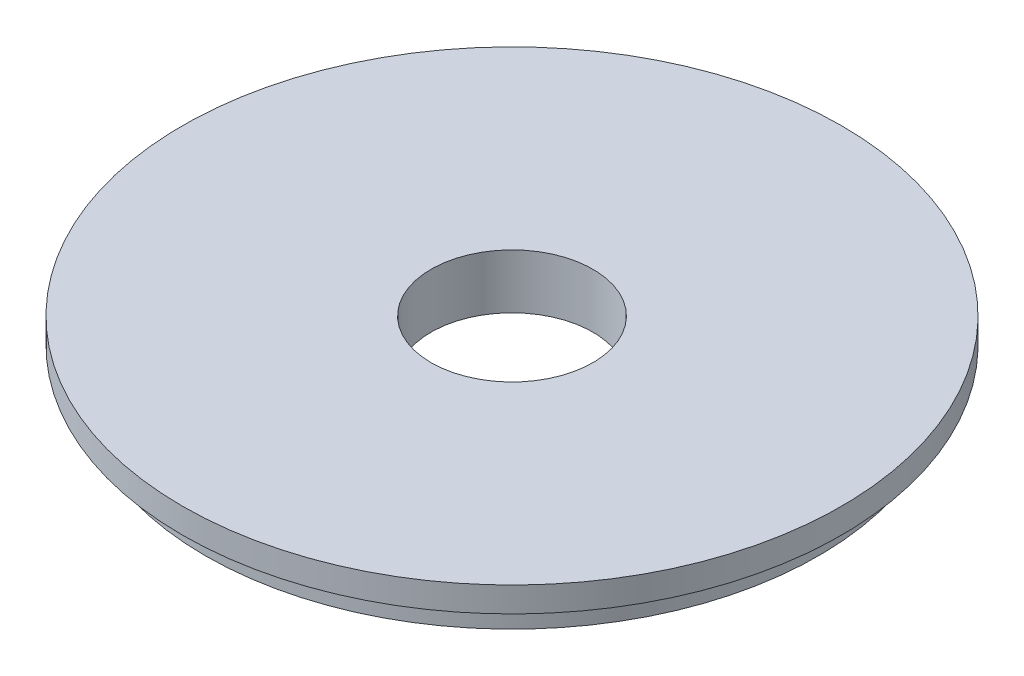
ISO-10303-21;
HEADER;
FILE_DESCRIPTION(('STEP AP214'),'2;1');
FILE_NAME('part.step','',(''),(''),'','','');
FILE_SCHEMA(('AUTOMOTIVE_DESIGN { 1 0 10303 214 1 1 1 1 }'));
ENDSEC;
DATA;
#1=APPLICATION_CONTEXT('core data for automotive mechanical design processes');
#2=APPLICATION_PROTOCOL_DEFINITION('international standard','automotive_design',2000,#1);
#3=PRODUCT_CONTEXT('',#1,'mechanical');
#4=PRODUCT('Part','Part','',(#3));
#5=PRODUCT_RELATED_PRODUCT_CATEGORY('part','',(#4));
#6=PRODUCT_DEFINITION_FORMATION('','',#4);
#7=PRODUCT_DEFINITION_CONTEXT('part definition',#1,'design');
#8=PRODUCT_DEFINITION('design','',#6,#7);
#9=PRODUCT_DEFINITION_SHAPE('','',#8);
#10=(LENGTH_UNIT() NAMED_UNIT(*) SI_UNIT(.MILLI.,.METRE.));
#11=(NAMED_UNIT(*) PLANE_ANGLE_UNIT() SI_UNIT($,.RADIAN.));
#12=(NAMED_UNIT(*) SI_UNIT($,.STERADIAN.) SOLID_ANGLE_UNIT());
#13=UNCERTAINTY_MEASURE_WITH_UNIT(LENGTH_MEASURE(1.E-05),#10,'distance_accuracy_value','');
#14=(GEOMETRIC_REPRESENTATION_CONTEXT(3) GLOBAL_UNCERTAINTY_ASSIGNED_CONTEXT((#13)) GLOBAL_UNIT_ASSIGNED_CONTEXT((#10,
#11,#12)) REPRESENTATION_CONTEXT('',''));
#15=CARTESIAN_POINT('',(0.,0.,0.));
#16=DIRECTION('',(0.,0.,1.));
#17=DIRECTION('',(1.,0.,0.));
#18=AXIS2_PLACEMENT_3D('',#15,#16,#17);
#19=CARTESIAN_POINT('',(0.,0.,0.));
#20=DIRECTION('',(0.,1.,0.));
#21=DIRECTION('',(0.,0.,1.));
#22=AXIS2_PLACEMENT_3D('',#19,#20,#21);
#23=CYLINDRICAL_SURFACE('',#22,11.3157);
#24=CARTESIAN_POINT('',(0.,0.,0.));
#25=DIRECTION('',(0.,1.,0.));
#26=DIRECTION('',(0.,0.,1.));
#27=AXIS2_PLACEMENT_3D('',#24,#25,#26);
#28=CIRCLE('',#27,11.3157);
#29=CARTESIAN_POINT('',(0.,0.,11.3157));
#30=VERTEX_POINT('',#29);
#31=EDGE_CURVE('E10',#30,#30,#28,.T.);
#32=ORIENTED_EDGE('',*,*,#31,.T.);
#33=EDGE_LOOP('',(#32));
#34=FACE_BOUND('',#33,.T.);
#35=CARTESIAN_POINT('',(0.,-7.61999999999996,0.));
#36=DIRECTION('',(0.,1.,0.));
#37=DIRECTION('',(0.,0.,1.));
#38=AXIS2_PLACEMENT_3D('',#35,#36,#37);
#39=CIRCLE('',#38,11.3157);
#40=CARTESIAN_POINT('',(0.,-7.61999999999996,11.3157));
#41=VERTEX_POINT('',#40);
#42=EDGE_CURVE('E58',#41,#41,#39,.T.);
#43=ORIENTED_EDGE('',*,*,#42,.F.);
#44=EDGE_LOOP('',(#43));
#45=FACE_BOUND('',#44,.T.);
#46=ADVANCED_FACE('F35',(#34,#45),#23,.F.);
#47=CARTESIAN_POINT('',(-11.3157,0.,0.));
#48=DIRECTION('',(0.,1.,0.));
#49=DIRECTION('',(0.,0.,1.));
#50=AXIS2_PLACEMENT_3D('',#47,#48,#49);
#51=PLANE('',#50);
#52=CARTESIAN_POINT('',(0.,0.,0.));
#53=DIRECTION('',(0.,1.,0.));
#54=DIRECTION('',(0.,0.,1.));
#55=AXIS2_PLACEMENT_3D('',#52,#53,#54);
#56=CIRCLE('',#55,46.0756);
#57=CARTESIAN_POINT('',(0.,0.,46.0756));
#58=VERTEX_POINT('',#57);
#59=EDGE_CURVE('E41',#58,#58,#56,.T.);
#60=ORIENTED_EDGE('',*,*,#59,.T.);
#61=EDGE_LOOP('',(#60));
#62=FACE_BOUND('',#61,.T.);
#63=ORIENTED_EDGE('',*,*,#31,.F.);
#64=EDGE_LOOP('',(#63));
#65=FACE_BOUND('',#64,.T.);
#66=ADVANCED_FACE('F67',(#62,#65),#51,.T.);
#67=CARTESIAN_POINT('',(0.,0.,0.));
#68=DIRECTION('',(0.,1.,0.));
#69=DIRECTION('',(0.,0.,1.));
#70=AXIS2_PLACEMENT_3D('',#67,#68,#69);
#71=CYLINDRICAL_SURFACE('',#70,46.0756);
#72=CARTESIAN_POINT('',(0.,-3.50519999999999,0.));
#73=DIRECTION('',(0.,1.,0.));
#74=DIRECTION('',(0.,0.,1.));
#75=AXIS2_PLACEMENT_3D('',#72,#73,#74);
#76=CIRCLE('',#75,46.0756);
#77=CARTESIAN_POINT('',(0.,-3.50519999999999,46.0756));
#78=VERTEX_POINT('',#77);
#79=EDGE_CURVE('E45',#78,#78,#76,.T.);
#80=ORIENTED_EDGE('',*,*,#79,.T.);
#81=EDGE_LOOP('',(#80));
#82=FACE_BOUND('',#81,.T.);
#83=ORIENTED_EDGE('',*,*,#59,.F.);
#84=EDGE_LOOP('',(#83));
#85=FACE_BOUND('',#84,.T.);
#86=ADVANCED_FACE('F71',(#82,#85),#71,.T.);
#87=CARTESIAN_POINT('',(-46.0756,-3.50519999999999,0.));
#88=DIRECTION('',(0.,-1.,0.));
#89=DIRECTION('',(0.,0.,-1.));
#90=AXIS2_PLACEMENT_3D('',#87,#88,#89);
#91=PLANE('',#90);
#92=CARTESIAN_POINT('',(0.,-3.50519999999999,0.));
#93=DIRECTION('',(0.,1.,0.));
#94=DIRECTION('',(0.,0.,1.));
#95=AXIS2_PLACEMENT_3D('',#92,#93,#94);
#96=CIRCLE('',#95,42.8625);
#97=CARTESIAN_POINT('',(0.,-3.50519999999999,42.8625));
#98=VERTEX_POINT('',#97);
#99=EDGE_CURVE('E49',#98,#98,#96,.T.);
#100=ORIENTED_EDGE('',*,*,#99,.T.);
#101=EDGE_LOOP('',(#100));
#102=FACE_BOUND('',#101,.T.);
#103=ORIENTED_EDGE('',*,*,#79,.F.);
#104=EDGE_LOOP('',(#103));
#105=FACE_BOUND('',#104,.T.);
#106=ADVANCED_FACE('F75',(#102,#105),#91,.T.);
#107=CARTESIAN_POINT('',(0.,0.,0.));
#108=DIRECTION('',(0.,1.,0.));
#109=DIRECTION('',(0.,0.,1.));
#110=AXIS2_PLACEMENT_3D('',#107,#108,#109);
#111=CYLINDRICAL_SURFACE('',#110,42.8625);
#112=CARTESIAN_POINT('',(0.,-7.61999999999996,0.));
#113=DIRECTION('',(0.,1.,0.));
#114=DIRECTION('',(0.,0.,1.));
#115=AXIS2_PLACEMENT_3D('',#112,#113,#114);
#116=CIRCLE('',#115,42.8625);
#117=CARTESIAN_POINT('',(0.,-7.61999999999996,42.8625));
#118=VERTEX_POINT('',#117);
#119=EDGE_CURVE('E54',#118,#118,#116,.T.);
#120=ORIENTED_EDGE('',*,*,#119,.T.);
#121=EDGE_LOOP('',(#120));
#122=FACE_BOUND('',#121,.T.);
#123=ORIENTED_EDGE('',*,*,#99,.F.);
#124=EDGE_LOOP('',(#123));
#125=FACE_BOUND('',#124,.T.);
#126=ADVANCED_FACE('F82',(#122,#125),#111,.T.);
#127=CARTESIAN_POINT('',(-42.8625,-7.61999999999996,0.));
#128=DIRECTION('',(0.,-1.,0.));
#129=DIRECTION('',(0.,0.,-1.));
#130=AXIS2_PLACEMENT_3D('',#127,#128,#129);
#131=PLANE('',#130);
#132=ORIENTED_EDGE('',*,*,#42,.T.);
#133=EDGE_LOOP('',(#132));
#134=FACE_BOUND('',#133,.T.);
#135=ORIENTED_EDGE('',*,*,#119,.F.);
#136=EDGE_LOOP('',(#135));
#137=FACE_BOUND('',#136,.T.);
#138=ADVANCED_FACE('F63',(#134,#137),#131,.T.);
#139=CLOSED_SHELL('',(#46,#66,#86,#106,#126,#138));
#140=MANIFOLD_SOLID_BREP('B2',#139);
#141=ADVANCED_BREP_SHAPE_REPRESENTATION('',(#18,#140),#14);
#142=SHAPE_DEFINITION_REPRESENTATION(#9,#141);
ENDSEC;
END-ISO-10303-21;
